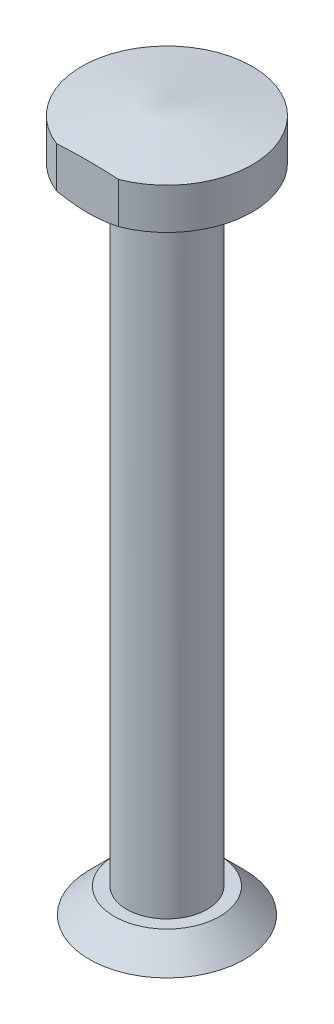
ISO-10303-21;
HEADER;
FILE_DESCRIPTION(('STEP AP214'),'2;1');
FILE_NAME('part.step','',(''),(''),'','','');
FILE_SCHEMA(('AUTOMOTIVE_DESIGN { 1 0 10303 214 1 1 1 1 }'));
ENDSEC;
DATA;
#1=APPLICATION_CONTEXT('core data for automotive mechanical design processes');
#2=APPLICATION_PROTOCOL_DEFINITION('international standard','automotive_design',2000,#1);
#3=PRODUCT_CONTEXT('',#1,'mechanical');
#4=PRODUCT('Part','Part','',(#3));
#5=PRODUCT_RELATED_PRODUCT_CATEGORY('part','',(#4));
#6=PRODUCT_DEFINITION_FORMATION('','',#4);
#7=PRODUCT_DEFINITION_CONTEXT('part definition',#1,'design');
#8=PRODUCT_DEFINITION('design','',#6,#7);
#9=PRODUCT_DEFINITION_SHAPE('','',#8);
#10=(LENGTH_UNIT() NAMED_UNIT(*) SI_UNIT(.MILLI.,.METRE.));
#11=(NAMED_UNIT(*) PLANE_ANGLE_UNIT() SI_UNIT($,.RADIAN.));
#12=(NAMED_UNIT(*) SI_UNIT($,.STERADIAN.) SOLID_ANGLE_UNIT());
#13=UNCERTAINTY_MEASURE_WITH_UNIT(LENGTH_MEASURE(1.E-05),#10,'distance_accuracy_value','');
#14=(GEOMETRIC_REPRESENTATION_CONTEXT(3) GLOBAL_UNCERTAINTY_ASSIGNED_CONTEXT((#13)) GLOBAL_UNIT_ASSIGNED_CONTEXT((#10,
#11,#12)) REPRESENTATION_CONTEXT('',''));
#15=CARTESIAN_POINT('',(0.,0.,0.));
#16=DIRECTION('',(0.,0.,1.));
#17=DIRECTION('',(1.,0.,0.));
#18=AXIS2_PLACEMENT_3D('',#15,#16,#17);
#19=CARTESIAN_POINT('',(0.,2.30434167212368,0.));
#20=DIRECTION('',(0.,-1.,0.));
#21=DIRECTION('',(0.,0.,-1.));
#22=AXIS2_PLACEMENT_3D('',#19,#20,#21);
#23=CONICAL_SURFACE('',#22,3.49249999999998,1.4121410646085);
#24=CARTESIAN_POINT('',(0.,2.86314167212368,0.));
#25=VERTEX_POINT('',#24);
#26=VERTEX_LOOP('',#25);
#27=FACE_BOUND('',#26,.T.);
#28=CARTESIAN_POINT('',(2.47572997755086,2.2090195761839,3.25340686819215));
#29=CARTESIAN_POINT('',(2.19148880874308,2.23657759326628,3.25340686819215));
#30=CARTESIAN_POINT('',(1.90686088921516,2.26117156316967,3.25340686819215));
#31=CARTESIAN_POINT('',(1.33692522112749,2.30182514168628,3.25340686819215));
#32=CARTESIAN_POINT('',(1.05161729756321,2.3178822434593,3.25340686819215));
#33=CARTESIAN_POINT('',(0.623906033828626,2.33357726096373,3.25340686819215));
#34=CARTESIAN_POINT('',(0.481660272405841,2.33741114785915,3.25340686819215));
#35=CARTESIAN_POINT('',(0.197118818296021,2.34213260556846,3.25340686819215));
#36=CARTESIAN_POINT('',(0.0548231254395899,2.34302016628811,3.25340686819215));
#37=CARTESIAN_POINT('',(-0.229723724524694,2.34179694726992,3.25340686819215));
#38=CARTESIAN_POINT('',(-0.371974884491866,2.33968683547214,3.25340686819215));
#39=CARTESIAN_POINT('',(-0.656403592254242,2.33258398766546,3.25340686819215));
#40=CARTESIAN_POINT('',(-0.798581139828066,2.32759124303719,3.25340686819215));
#41=CARTESIAN_POINT('',(-1.22424473246404,2.30866896871365,3.25340686819215));
#42=CARTESIAN_POINT('',(-1.50755714283607,2.29079039462212,3.25340686819215));
#43=CARTESIAN_POINT('',(-2.07362597676108,2.24713882317481,3.25340686819215));
#44=CARTESIAN_POINT('',(-2.35638220227204,2.22136339687515,3.25340686819215));
#45=CARTESIAN_POINT('',(-2.9225711908186,2.16429587060913,3.25340686819215));
#46=CARTESIAN_POINT('',(-3.20600153500592,2.13298022725508,3.25340686819215));
#47=CARTESIAN_POINT('',(-3.63072274741707,2.08327354864869,3.25340686819215));
#48=CARTESIAN_POINT('',(-3.77217783498291,2.06625535865826,3.25340686819215));
#49=CARTESIAN_POINT('',(-4.05499092693565,2.03145750411266,3.25340686819215));
#50=CARTESIAN_POINT('',(-4.19634893362302,2.01367785828167,3.25340686819215));
#51=CARTESIAN_POINT('',(-4.33766797497269,1.99559311175126,3.25340686819215));
#52=B_SPLINE_CURVE_WITH_KNOTS('',3,(#28,#29,#30,#31,#32,#33,#34,#35,#36,#37,#38,#39,#40,#41,#42,
#43,#44,#45,#46,#47,#48,#49,#50,#51),.UNSPECIFIED.,.F.,.F.,(4,2,2,2,2,2,2,2,2,2,2,4),(0.,
0.856865702957391,1.71398288463082,2.14084550360403,2.56770958502469,2.99447856769729,
3.42124882645971,4.27270449420406,5.12442231930309,5.97985052323416,6.40727462042814,
6.83468821329541),.UNSPECIFIED.);
#53=CARTESIAN_POINT('',(1.27,2.30434167212368,3.25340686819215));
#54=VERTEX_POINT('',#53);
#55=CARTESIAN_POINT('',(-1.26999999999999,2.30434167212368,3.25340686819215));
#56=VERTEX_POINT('',#55);
#57=EDGE_CURVE('E11',#54,#56,#52,.T.);
#58=ORIENTED_EDGE('',*,*,#57,.F.);
#59=CARTESIAN_POINT('',(0.,2.30434167212368,0.));
#60=DIRECTION('',(0.,-1.,0.));
#61=DIRECTION('',(1.,0.,0.));
#62=AXIS2_PLACEMENT_3D('',#59,#60,#61);
#63=CIRCLE('',#62,3.49249999999998);
#64=EDGE_CURVE('E79',#54,#56,#63,.F.);
#65=ORIENTED_EDGE('',*,*,#64,.T.);
#66=EDGE_LOOP('',(#58,#65));
#67=FACE_BOUND('',#66,.T.);
#68=ADVANCED_FACE('F39',(#27,#67),#23,.T.);
#69=CARTESIAN_POINT('',(0.,-26.035,0.));
#70=DIRECTION('',(0.,-1.,0.));
#71=DIRECTION('',(0.,0.,-1.));
#72=AXIS2_PLACEMENT_3D('',#69,#70,#71);
#73=PLANE('',#72);
#74=CARTESIAN_POINT('',(0.,-26.035,0.));
#75=DIRECTION('',(0.,-1.,0.));
#76=DIRECTION('',(0.,0.,-1.));
#77=AXIS2_PLACEMENT_3D('',#74,#75,#76);
#78=CIRCLE('',#77,3.175);
#79=CARTESIAN_POINT('',(0.,-26.035,-3.175));
#80=VERTEX_POINT('',#79);
#81=EDGE_CURVE('E89',#80,#80,#78,.F.);
#82=ORIENTED_EDGE('',*,*,#81,.F.);
#83=EDGE_LOOP('',(#82));
#84=FACE_BOUND('',#83,.T.);
#85=ADVANCED_FACE('F41',(#84),#73,.T.);
#86=CARTESIAN_POINT('',(0.,4.6355,0.));
#87=DIRECTION('',(0.,-1.,0.));
#88=DIRECTION('',(0.,0.,-1.));
#89=AXIS2_PLACEMENT_3D('',#86,#87,#88);
#90=CYLINDRICAL_SURFACE('',#89,3.49249999999998);
#91=ORIENTED_EDGE('',*,*,#64,.F.);
#92=DIRECTION('',(0.,1.,0.));
#93=VECTOR('',#92,1.);
#94=CARTESIAN_POINT('',(1.27,0.,3.25340686819215));
#95=LINE('',#94,#93);
#96=CARTESIAN_POINT('',(1.27,0.62794167212368,3.25340686819215));
#97=VERTEX_POINT('',#96);
#98=EDGE_CURVE('E60',#54,#97,#95,.F.);
#99=ORIENTED_EDGE('',*,*,#98,.T.);
#100=CARTESIAN_POINT('',(0.,0.62794167212368,0.));
#101=DIRECTION('',(0.,1.,0.));
#102=DIRECTION('',(-1.,0.,0.));
#103=AXIS2_PLACEMENT_3D('',#100,#101,#102);
#104=CIRCLE('',#103,3.49249999999997);
#105=CARTESIAN_POINT('',(-1.26999999999999,0.62794167212368,3.25340686819215));
#106=VERTEX_POINT('',#105);
#107=EDGE_CURVE('E81',#106,#97,#104,.F.);
#108=ORIENTED_EDGE('',*,*,#107,.F.);
#109=DIRECTION('',(0.,1.,0.));
#110=VECTOR('',#109,1.);
#111=CARTESIAN_POINT('',(-1.26999999999999,0.,3.25340686819215));
#112=LINE('',#111,#110);
#113=EDGE_CURVE('E74',#106,#56,#112,.T.);
#114=ORIENTED_EDGE('',*,*,#113,.T.);
#115=EDGE_LOOP('',(#91,#99,#108,#114));
#116=FACE_BOUND('',#115,.T.);
#117=ADVANCED_FACE('F78',(#116),#90,.T.);
#118=CARTESIAN_POINT('',(1.27,0.,3.25340686819215));
#119=DIRECTION('',(0.,0.,-1.));
#120=DIRECTION('',(-1.,0.,0.));
#121=AXIS2_PLACEMENT_3D('',#118,#119,#120);
#122=PLANE('',#121);
#123=ORIENTED_EDGE('',*,*,#98,.F.);
#124=ORIENTED_EDGE('',*,*,#57,.T.);
#125=ORIENTED_EDGE('',*,*,#113,.F.);
#126=CARTESIAN_POINT('',(1.27,0.627941672123681,3.25340686819215));
#127=CARTESIAN_POINT('',(1.19185442410432,0.611531398834379,3.25340686819215));
#128=CARTESIAN_POINT('',(1.11343527376144,0.596385289302162,3.25340686819215));
#129=CARTESIAN_POINT('',(0.956094642560896,0.568853854683347,3.25340686819215));
#130=CARTESIAN_POINT('',(0.877173039336201,0.556469230821728,3.25340686819215));
#131=CARTESIAN_POINT('',(0.718865878140388,0.534695441173843,3.25340686819215));
#132=CARTESIAN_POINT('',(0.63948007642738,0.525308026603408,3.25340686819215));
#133=CARTESIAN_POINT('',(0.480406175495373,0.509728519900604,3.25340686819215));
#134=CARTESIAN_POINT('',(0.400718104909794,0.503536132365299,3.25340686819215));
#135=CARTESIAN_POINT('',(0.164002693533573,0.4901314793812,3.25340686819215));
#136=CARTESIAN_POINT('',(0.00667373119174093,0.487719145714799,3.25340686819215));
#137=CARTESIAN_POINT('',(-0.307527045773434,0.49609668880008,3.25340686819215));
#138=CARTESIAN_POINT('',(-0.464399084913559,0.506878302128719,3.25340686819215));
#139=CARTESIAN_POINT('',(-0.674920259314543,0.529643894367875,3.25340686819215));
#140=CARTESIAN_POINT('',(-0.729197093350223,0.536262626688357,3.25340686819215));
#141=CARTESIAN_POINT('',(-0.837557473565169,0.550909179244312,3.25340686819215));
#142=CARTESIAN_POINT('',(-0.891641038969573,0.558936855107432,3.25340686819215));
#143=CARTESIAN_POINT('',(-0.999910953022564,0.576383287192542,3.25340686819215));
#144=CARTESIAN_POINT('',(-1.05409600746063,0.585810014730572,3.25340686819215));
#145=CARTESIAN_POINT('',(-1.16222974465087,0.60593910609378,3.25340686819215));
#146=CARTESIAN_POINT('',(-1.21617842407048,0.616641487844235,3.25340686819215));
#147=CARTESIAN_POINT('',(-1.26999999999999,0.62794167212368,3.25340686819215));
#148=B_SPLINE_CURVE_WITH_KNOTS('',3,(#126,#127,#128,#129,#130,#131,#132,#133,#134,#135,#136,
#137,#138,#139,#140,#141,#142,#143,#144,#145,#146,#147),.UNSPECIFIED.,.F.,.F.,(4,2,2,2,2,2,2,2,
2,2,4),(0.,0.239551176665022,0.479163113541633,0.718914796270866,0.958644308280789,
1.43009859386578,1.90125775675973,2.06528297965039,2.2292914049222,2.3942729699424,
2.55925685352909),.UNSPECIFIED.);
#149=EDGE_CURVE('E92',#97,#106,#148,.T.);
#150=ORIENTED_EDGE('',*,*,#149,.F.);
#151=EDGE_LOOP('',(#123,#124,#125,#150));
#152=FACE_BOUND('',#151,.T.);
#153=ADVANCED_FACE('F73',(#152),#122,.F.);
#154=CARTESIAN_POINT('',(0.,-26.035,0.));
#155=DIRECTION('',(0.,-1.,0.));
#156=DIRECTION('',(0.,0.,-1.));
#157=AXIS2_PLACEMENT_3D('',#154,#155,#156);
#158=CONICAL_SURFACE('',#157,3.175,0.785398163397448);
#159=ORIENTED_EDGE('',*,*,#81,.T.);
#160=EDGE_LOOP('',(#159));
#161=FACE_BOUND('',#160,.T.);
#162=CARTESIAN_POINT('',(0.,-25.019,0.));
#163=DIRECTION('',(0.,-1.,0.));
#164=DIRECTION('',(0.,0.,-1.));
#165=AXIS2_PLACEMENT_3D('',#162,#163,#164);
#166=CIRCLE('',#165,2.15899999999999);
#167=CARTESIAN_POINT('',(0.,-25.019,-2.15899999999999));
#168=VERTEX_POINT('',#167);
#169=EDGE_CURVE('E88',#168,#168,#166,.T.);
#170=ORIENTED_EDGE('',*,*,#169,.T.);
#171=EDGE_LOOP('',(#170));
#172=FACE_BOUND('',#171,.T.);
#173=ADVANCED_FACE('F112',(#161,#172),#158,.T.);
#174=CARTESIAN_POINT('',(0.,0.62794167212368,0.));
#175=DIRECTION('',(0.,1.,0.));
#176=DIRECTION('',(0.,0.,1.));
#177=AXIS2_PLACEMENT_3D('',#174,#175,#176);
#178=CONICAL_SURFACE('',#177,3.49249999999997,1.0471975511966);
#179=CARTESIAN_POINT('',(0.,-0.43524884858901,0.));
#180=DIRECTION('',(0.,-1.,0.));
#181=DIRECTION('',(0.,0.,-1.));
#182=AXIS2_PLACEMENT_3D('',#179,#180,#181);
#183=CIRCLE('',#182,1.651);
#184=CARTESIAN_POINT('',(0.,-0.43524884858901,-1.651));
#185=VERTEX_POINT('',#184);
#186=EDGE_CURVE('E85',#185,#185,#183,.T.);
#187=ORIENTED_EDGE('',*,*,#186,.F.);
#188=EDGE_LOOP('',(#187));
#189=FACE_BOUND('',#188,.T.);
#190=ORIENTED_EDGE('',*,*,#107,.T.);
#191=ORIENTED_EDGE('',*,*,#149,.T.);
#192=EDGE_LOOP('',(#190,#191));
#193=FACE_BOUND('',#192,.T.);
#194=ADVANCED_FACE('F107',(#189,#193),#178,.T.);
#195=CARTESIAN_POINT('',(0.,-25.019,0.));
#196=DIRECTION('',(0.,-1.,0.));
#197=DIRECTION('',(0.,0.,-1.));
#198=AXIS2_PLACEMENT_3D('',#195,#196,#197);
#199=PLANE('',#198);
#200=CARTESIAN_POINT('',(0.,-25.019,0.));
#201=DIRECTION('',(0.,-1.,0.));
#202=DIRECTION('',(0.,0.,-1.));
#203=AXIS2_PLACEMENT_3D('',#200,#201,#202);
#204=CIRCLE('',#203,1.651);
#205=CARTESIAN_POINT('',(0.,-25.019,-1.651));
#206=VERTEX_POINT('',#205);
#207=EDGE_CURVE('E54',#206,#206,#204,.F.);
#208=ORIENTED_EDGE('',*,*,#207,.F.);
#209=EDGE_LOOP('',(#208));
#210=FACE_BOUND('',#209,.T.);
#211=ORIENTED_EDGE('',*,*,#169,.F.);
#212=EDGE_LOOP('',(#211));
#213=FACE_BOUND('',#212,.T.);
#214=ADVANCED_FACE('F111',(#210,#213),#199,.F.);
#215=CARTESIAN_POINT('',(0.,4.6355,0.));
#216=DIRECTION('',(0.,-1.,0.));
#217=DIRECTION('',(0.,0.,-1.));
#218=AXIS2_PLACEMENT_3D('',#215,#216,#217);
#219=CYLINDRICAL_SURFACE('',#218,1.651);
#220=ORIENTED_EDGE('',*,*,#207,.T.);
#221=EDGE_LOOP('',(#220));
#222=FACE_BOUND('',#221,.T.);
#223=ORIENTED_EDGE('',*,*,#186,.T.);
#224=EDGE_LOOP('',(#223));
#225=FACE_BOUND('',#224,.T.);
#226=ADVANCED_FACE('F127',(#222,#225),#219,.T.);
#227=CLOSED_SHELL('',(#68,#85,#117,#153,#173,#194,#214,#226));
#228=MANIFOLD_SOLID_BREP('B2',#227);
#229=ADVANCED_BREP_SHAPE_REPRESENTATION('',(#18,#228),#14);
#230=SHAPE_DEFINITION_REPRESENTATION(#9,#229);
ENDSEC;
END-ISO-10303-21;
